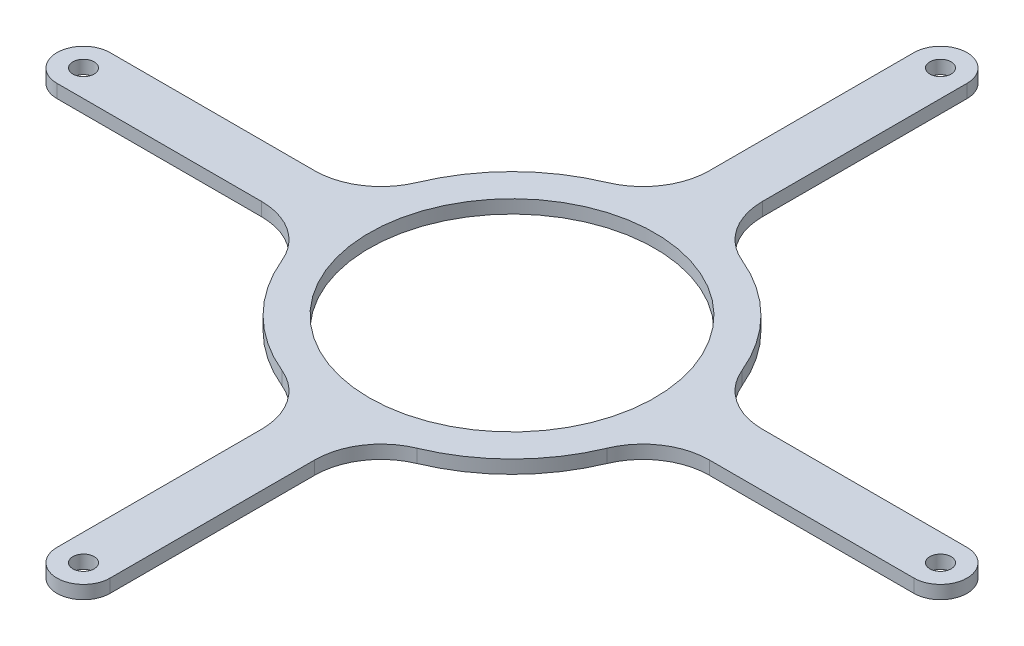
ISO-10303-21;
HEADER;
FILE_DESCRIPTION(('STEP AP214'),'2;1');
FILE_NAME('part.step','',(''),(''),'','','');
FILE_SCHEMA(('AUTOMOTIVE_DESIGN { 1 0 10303 214 1 1 1 1 }'));
ENDSEC;
DATA;
#1=APPLICATION_CONTEXT('core data for automotive mechanical design processes');
#2=APPLICATION_PROTOCOL_DEFINITION('international standard','automotive_design',2000,#1);
#3=PRODUCT_CONTEXT('',#1,'mechanical');
#4=PRODUCT('Part','Part','',(#3));
#5=PRODUCT_RELATED_PRODUCT_CATEGORY('part','',(#4));
#6=PRODUCT_DEFINITION_FORMATION('','',#4);
#7=PRODUCT_DEFINITION_CONTEXT('part definition',#1,'design');
#8=PRODUCT_DEFINITION('design','',#6,#7);
#9=PRODUCT_DEFINITION_SHAPE('','',#8);
#10=(LENGTH_UNIT() NAMED_UNIT(*) SI_UNIT(.MILLI.,.METRE.));
#11=(NAMED_UNIT(*) PLANE_ANGLE_UNIT() SI_UNIT($,.RADIAN.));
#12=(NAMED_UNIT(*) SI_UNIT($,.STERADIAN.) SOLID_ANGLE_UNIT());
#13=UNCERTAINTY_MEASURE_WITH_UNIT(LENGTH_MEASURE(1.E-05),#10,'distance_accuracy_value','');
#14=(GEOMETRIC_REPRESENTATION_CONTEXT(3) GLOBAL_UNCERTAINTY_ASSIGNED_CONTEXT((#13)) GLOBAL_UNIT_ASSIGNED_CONTEXT((#10,
#11,#12)) REPRESENTATION_CONTEXT('',''));
#15=CARTESIAN_POINT('',(0.,0.,0.));
#16=DIRECTION('',(0.,0.,1.));
#17=DIRECTION('',(1.,0.,0.));
#18=AXIS2_PLACEMENT_3D('',#15,#16,#17);
#19=CARTESIAN_POINT('',(0.,2.,0.));
#20=DIRECTION('',(0.,1.,0.));
#21=DIRECTION('',(0.,0.,1.));
#22=AXIS2_PLACEMENT_3D('',#19,#20,#21);
#23=PLANE('',#22);
#24=CARTESIAN_POINT('',(0.,2.,64.4999999999991));
#25=DIRECTION('',(0.,1.,0.));
#26=DIRECTION('',(0.,0.,1.));
#27=AXIS2_PLACEMENT_3D('',#24,#25,#26);
#28=CIRCLE('',#27,1.6);
#29=CARTESIAN_POINT('',(0.,2.,66.0999999999991));
#30=VERTEX_POINT('',#29);
#31=EDGE_CURVE('E566',#30,#30,#28,.T.);
#32=ORIENTED_EDGE('',*,*,#31,.F.);
#33=EDGE_LOOP('',(#32));
#34=FACE_BOUND('',#33,.T.);
#35=CARTESIAN_POINT('',(-1.46367293285543E-13,2.,-64.4999999999991));
#36=DIRECTION('',(0.,1.,0.));
#37=DIRECTION('',(0.,0.,1.));
#38=AXIS2_PLACEMENT_3D('',#35,#36,#37);
#39=CIRCLE('',#38,1.6);
#40=CARTESIAN_POINT('',(-1.46367293285543E-13,2.,-62.8999999999991));
#41=VERTEX_POINT('',#40);
#42=EDGE_CURVE('E550',#41,#41,#39,.T.);
#43=ORIENTED_EDGE('',*,*,#42,.F.);
#44=EDGE_LOOP('',(#43));
#45=FACE_BOUND('',#44,.T.);
#46=DIRECTION('',(-1.,0.,0.));
#47=VECTOR('',#46,1.);
#48=CARTESIAN_POINT('',(26.1963737948595,2.,-4.));
#49=LINE('',#48,#47);
#50=CARTESIAN_POINT('',(64.4999999999991,2.,-4.));
#51=VERTEX_POINT('',#50);
#52=CARTESIAN_POINT('',(33.7083075813664,2.,-4.));
#53=VERTEX_POINT('',#52);
#54=EDGE_CURVE('E279',#51,#53,#49,.T.);
#55=ORIENTED_EDGE('',*,*,#54,.T.);
#56=CARTESIAN_POINT('',(33.7083075813664,2.,-14.));
#57=DIRECTION('',(0.,1.,0.));
#58=DIRECTION('',(0.,0.,1.));
#59=AXIS2_PLACEMENT_3D('',#56,#57,#58);
#60=CIRCLE('',#59,10.);
#61=CARTESIAN_POINT('',(24.4731548193482,2.,-10.1643835616438));
#62=VERTEX_POINT('',#61);
#63=EDGE_CURVE('E420',#53,#62,#60,.F.);
#64=ORIENTED_EDGE('',*,*,#63,.T.);
#65=CARTESIAN_POINT('',(0.,2.,0.));
#66=DIRECTION('',(0.,1.,0.));
#67=DIRECTION('',(0.,0.,1.));
#68=AXIS2_PLACEMENT_3D('',#65,#66,#67);
#69=CIRCLE('',#68,26.5);
#70=CARTESIAN_POINT('',(10.1643835616439,2.,-24.4731548193482));
#71=VERTEX_POINT('',#70);
#72=EDGE_CURVE('E219',#62,#71,#69,.T.);
#73=ORIENTED_EDGE('',*,*,#72,.T.);
#74=CARTESIAN_POINT('',(14.,2.,-33.7083075813664));
#75=DIRECTION('',(0.,1.,0.));
#76=DIRECTION('',(0.,0.,1.));
#77=AXIS2_PLACEMENT_3D('',#74,#75,#76);
#78=CIRCLE('',#77,10.);
#79=CARTESIAN_POINT('',(4.,2.,-33.7083075813664));
#80=VERTEX_POINT('',#79);
#81=EDGE_CURVE('E214',#71,#80,#78,.F.);
#82=ORIENTED_EDGE('',*,*,#81,.T.);
#83=DIRECTION('',(0.,0.,-1.));
#84=VECTOR('',#83,1.);
#85=CARTESIAN_POINT('',(4.,2.,-26.1963737948595));
#86=LINE('',#85,#84);
#87=CARTESIAN_POINT('',(4.,2.,-64.4999999999991));
#88=VERTEX_POINT('',#87);
#89=EDGE_CURVE('E204',#80,#88,#86,.T.);
#90=ORIENTED_EDGE('',*,*,#89,.T.);
#91=CARTESIAN_POINT('',(-1.46367293285543E-13,2.,-64.4999999999991));
#92=DIRECTION('',(0.,1.,0.));
#93=DIRECTION('',(0.,0.,1.));
#94=AXIS2_PLACEMENT_3D('',#91,#92,#93);
#95=CIRCLE('',#94,4.);
#96=CARTESIAN_POINT('',(-4.00000000000015,2.,-64.4999999999991));
#97=VERTEX_POINT('',#96);
#98=EDGE_CURVE('E210',#88,#97,#95,.T.);
#99=ORIENTED_EDGE('',*,*,#98,.T.);
#100=DIRECTION('',(0.,0.,1.));
#101=VECTOR('',#100,1.);
#102=CARTESIAN_POINT('',(-4.,2.,-26.1963737948595));
#103=LINE('',#102,#101);
#104=CARTESIAN_POINT('',(-4.,2.,-33.7083075813664));
#105=VERTEX_POINT('',#104);
#106=EDGE_CURVE('E236',#97,#105,#103,.T.);
#107=ORIENTED_EDGE('',*,*,#106,.T.);
#108=CARTESIAN_POINT('',(-14.,2.,-33.7083075813664));
#109=DIRECTION('',(0.,1.,0.));
#110=DIRECTION('',(0.,0.,1.));
#111=AXIS2_PLACEMENT_3D('',#108,#109,#110);
#112=CIRCLE('',#111,10.);
#113=CARTESIAN_POINT('',(-10.1643835616438,2.,-24.4731548193482));
#114=VERTEX_POINT('',#113);
#115=EDGE_CURVE('E450',#105,#114,#112,.F.);
#116=ORIENTED_EDGE('',*,*,#115,.T.);
#117=CARTESIAN_POINT('',(0.,2.,0.));
#118=DIRECTION('',(0.,1.,0.));
#119=DIRECTION('',(0.,0.,1.));
#120=AXIS2_PLACEMENT_3D('',#117,#118,#119);
#121=CIRCLE('',#120,26.5000000000001);
#122=CARTESIAN_POINT('',(-24.4731548193482,2.,-10.1643835616438));
#123=VERTEX_POINT('',#122);
#124=EDGE_CURVE('E239',#114,#123,#121,.T.);
#125=ORIENTED_EDGE('',*,*,#124,.T.);
#126=CARTESIAN_POINT('',(-33.7083075813664,2.,-14.));
#127=DIRECTION('',(0.,1.,0.));
#128=DIRECTION('',(0.,0.,1.));
#129=AXIS2_PLACEMENT_3D('',#126,#127,#128);
#130=CIRCLE('',#129,10.);
#131=CARTESIAN_POINT('',(-33.7083075813664,2.,-3.99999999999999));
#132=VERTEX_POINT('',#131);
#133=EDGE_CURVE('E11',#123,#132,#130,.F.);
#134=ORIENTED_EDGE('',*,*,#133,.T.);
#135=DIRECTION('',(-1.,0.,0.));
#136=VECTOR('',#135,1.);
#137=CARTESIAN_POINT('',(-26.1963737948595,2.,-3.99999999999999));
#138=LINE('',#137,#136);
#139=CARTESIAN_POINT('',(-64.4999999999991,2.,-3.99999999999999));
#140=VERTEX_POINT('',#139);
#141=EDGE_CURVE('E245',#132,#140,#138,.T.);
#142=ORIENTED_EDGE('',*,*,#141,.T.);
#143=CARTESIAN_POINT('',(-64.4999999999991,2.,0.));
#144=DIRECTION('',(0.,1.,0.));
#145=DIRECTION('',(0.,0.,1.));
#146=AXIS2_PLACEMENT_3D('',#143,#144,#145);
#147=CIRCLE('',#146,4.);
#148=CARTESIAN_POINT('',(-64.4999999999991,2.,4.00000000000001));
#149=VERTEX_POINT('',#148);
#150=EDGE_CURVE('E248',#140,#149,#147,.T.);
#151=ORIENTED_EDGE('',*,*,#150,.T.);
#152=DIRECTION('',(1.,0.,0.));
#153=VECTOR('',#152,1.);
#154=CARTESIAN_POINT('',(-26.1963737948595,2.,4.00000000000001));
#155=LINE('',#154,#153);
#156=CARTESIAN_POINT('',(-33.7083075813664,2.,4.00000000000001));
#157=VERTEX_POINT('',#156);
#158=EDGE_CURVE('E251',#149,#157,#155,.T.);
#159=ORIENTED_EDGE('',*,*,#158,.T.);
#160=CARTESIAN_POINT('',(-33.7083075813664,2.,14.));
#161=DIRECTION('',(0.,1.,0.));
#162=DIRECTION('',(0.,0.,1.));
#163=AXIS2_PLACEMENT_3D('',#160,#161,#162);
#164=CIRCLE('',#163,10.);
#165=CARTESIAN_POINT('',(-24.4731548193482,2.,10.1643835616439));
#166=VERTEX_POINT('',#165);
#167=EDGE_CURVE('E444',#157,#166,#164,.F.);
#168=ORIENTED_EDGE('',*,*,#167,.T.);
#169=CARTESIAN_POINT('',(0.,2.,0.));
#170=DIRECTION('',(0.,1.,0.));
#171=DIRECTION('',(0.,0.,1.));
#172=AXIS2_PLACEMENT_3D('',#169,#170,#171);
#173=CIRCLE('',#172,26.5);
#174=CARTESIAN_POINT('',(-10.1643835616438,2.,24.4731548193482));
#175=VERTEX_POINT('',#174);
#176=EDGE_CURVE('E255',#166,#175,#173,.T.);
#177=ORIENTED_EDGE('',*,*,#176,.T.);
#178=CARTESIAN_POINT('',(-14.,2.,33.7083075813664));
#179=DIRECTION('',(0.,1.,0.));
#180=DIRECTION('',(0.,0.,1.));
#181=AXIS2_PLACEMENT_3D('',#178,#179,#180);
#182=CIRCLE('',#181,10.);
#183=CARTESIAN_POINT('',(-4.,2.,33.7083075813664));
#184=VERTEX_POINT('',#183);
#185=EDGE_CURVE('E438',#175,#184,#182,.F.);
#186=ORIENTED_EDGE('',*,*,#185,.T.);
#187=DIRECTION('',(0.,0.,1.));
#188=VECTOR('',#187,1.);
#189=CARTESIAN_POINT('',(-4.,2.,26.1963737948595));
#190=LINE('',#189,#188);
#191=CARTESIAN_POINT('',(-3.99999999999999,2.,64.4999999999991));
#192=VERTEX_POINT('',#191);
#193=EDGE_CURVE('E259',#184,#192,#190,.T.);
#194=ORIENTED_EDGE('',*,*,#193,.T.);
#195=CARTESIAN_POINT('',(0.,2.,64.4999999999991));
#196=DIRECTION('',(0.,1.,0.));
#197=DIRECTION('',(0.,0.,1.));
#198=AXIS2_PLACEMENT_3D('',#195,#196,#197);
#199=CIRCLE('',#198,4.);
#200=CARTESIAN_POINT('',(4.00000000000001,2.,64.4999999999991));
#201=VERTEX_POINT('',#200);
#202=EDGE_CURVE('E262',#192,#201,#199,.T.);
#203=ORIENTED_EDGE('',*,*,#202,.T.);
#204=DIRECTION('',(0.,0.,-1.));
#205=VECTOR('',#204,1.);
#206=CARTESIAN_POINT('',(4.,2.,26.1963737948595));
#207=LINE('',#206,#205);
#208=CARTESIAN_POINT('',(4.,2.,33.7083075813664));
#209=VERTEX_POINT('',#208);
#210=EDGE_CURVE('E265',#201,#209,#207,.T.);
#211=ORIENTED_EDGE('',*,*,#210,.T.);
#212=CARTESIAN_POINT('',(14.,2.,33.7083075813664));
#213=DIRECTION('',(0.,1.,0.));
#214=DIRECTION('',(0.,0.,1.));
#215=AXIS2_PLACEMENT_3D('',#212,#213,#214);
#216=CIRCLE('',#215,10.);
#217=CARTESIAN_POINT('',(10.1643835616439,2.,24.4731548193482));
#218=VERTEX_POINT('',#217);
#219=EDGE_CURVE('E432',#209,#218,#216,.F.);
#220=ORIENTED_EDGE('',*,*,#219,.T.);
#221=CARTESIAN_POINT('',(0.,2.,0.));
#222=DIRECTION('',(0.,1.,0.));
#223=DIRECTION('',(0.,0.,1.));
#224=AXIS2_PLACEMENT_3D('',#221,#222,#223);
#225=CIRCLE('',#224,26.5);
#226=CARTESIAN_POINT('',(24.4731548193482,2.,10.1643835616438));
#227=VERTEX_POINT('',#226);
#228=EDGE_CURVE('E269',#218,#227,#225,.T.);
#229=ORIENTED_EDGE('',*,*,#228,.T.);
#230=CARTESIAN_POINT('',(33.7083075813664,2.,14.));
#231=DIRECTION('',(0.,1.,0.));
#232=DIRECTION('',(0.,0.,1.));
#233=AXIS2_PLACEMENT_3D('',#230,#231,#232);
#234=CIRCLE('',#233,10.);
#235=CARTESIAN_POINT('',(33.7083075813664,2.,4.));
#236=VERTEX_POINT('',#235);
#237=EDGE_CURVE('E426',#227,#236,#234,.F.);
#238=ORIENTED_EDGE('',*,*,#237,.T.);
#239=DIRECTION('',(1.,0.,0.));
#240=VECTOR('',#239,1.);
#241=CARTESIAN_POINT('',(26.1963737948595,2.,4.));
#242=LINE('',#241,#240);
#243=CARTESIAN_POINT('',(64.4999999999991,2.,4.));
#244=VERTEX_POINT('',#243);
#245=EDGE_CURVE('E273',#236,#244,#242,.T.);
#246=ORIENTED_EDGE('',*,*,#245,.T.);
#247=CARTESIAN_POINT('',(64.4999999999991,2.,0.));
#248=DIRECTION('',(0.,1.,0.));
#249=DIRECTION('',(0.,0.,1.));
#250=AXIS2_PLACEMENT_3D('',#247,#248,#249);
#251=CIRCLE('',#250,4.);
#252=EDGE_CURVE('E276',#244,#51,#251,.T.);
#253=ORIENTED_EDGE('',*,*,#252,.T.);
#254=EDGE_LOOP('',(#55,#64,#73,#82,#90,#99,#107,#116,#125,#134,#142,#151,#159,#168,#177,#186,
#194,#203,#211,#220,#229,#238,#246,#253));
#255=FACE_BOUND('',#254,.T.);
#256=CARTESIAN_POINT('',(0.,2.,0.));
#257=DIRECTION('',(0.,1.,0.));
#258=DIRECTION('',(0.,0.,1.));
#259=AXIS2_PLACEMENT_3D('',#256,#257,#258);
#260=CIRCLE('',#259,21.5);
#261=CARTESIAN_POINT('',(0.,2.,21.5));
#262=VERTEX_POINT('',#261);
#263=EDGE_CURVE('E287',#262,#262,#260,.T.);
#264=ORIENTED_EDGE('',*,*,#263,.F.);
#265=EDGE_LOOP('',(#264));
#266=FACE_BOUND('',#265,.T.);
#267=CARTESIAN_POINT('',(64.4999999999991,2.,0.));
#268=DIRECTION('',(0.,1.,0.));
#269=DIRECTION('',(0.,0.,1.));
#270=AXIS2_PLACEMENT_3D('',#267,#268,#269);
#271=CIRCLE('',#270,1.60000000000001);
#272=CARTESIAN_POINT('',(64.4999999999991,2.,1.6));
#273=VERTEX_POINT('',#272);
#274=EDGE_CURVE('E558',#273,#273,#271,.T.);
#275=ORIENTED_EDGE('',*,*,#274,.F.);
#276=EDGE_LOOP('',(#275));
#277=FACE_BOUND('',#276,.T.);
#278=CARTESIAN_POINT('',(-64.4999999999991,2.,0.));
#279=DIRECTION('',(0.,1.,0.));
#280=DIRECTION('',(0.,0.,1.));
#281=AXIS2_PLACEMENT_3D('',#278,#279,#280);
#282=CIRCLE('',#281,1.60000000000001);
#283=CARTESIAN_POINT('',(-64.4999999999991,2.,1.60000000000002));
#284=VERTEX_POINT('',#283);
#285=EDGE_CURVE('E574',#284,#284,#282,.T.);
#286=ORIENTED_EDGE('',*,*,#285,.F.);
#287=EDGE_LOOP('',(#286));
#288=FACE_BOUND('',#287,.T.);
#289=ADVANCED_FACE('F45',(#34,#45,#255,#266,#277,#288),#23,.T.);
#290=CARTESIAN_POINT('',(0.,0.,0.));
#291=DIRECTION('',(0.,1.,0.));
#292=DIRECTION('',(0.,0.,1.));
#293=AXIS2_PLACEMENT_3D('',#290,#291,#292);
#294=PLANE('',#293);
#295=CARTESIAN_POINT('',(0.,0.,0.));
#296=DIRECTION('',(0.,1.,0.));
#297=DIRECTION('',(0.,0.,1.));
#298=AXIS2_PLACEMENT_3D('',#295,#296,#297);
#299=CIRCLE('',#298,26.5);
#300=CARTESIAN_POINT('',(24.4731548193482,0.,-10.1643835616438));
#301=VERTEX_POINT('',#300);
#302=CARTESIAN_POINT('',(10.1643835616439,0.,-24.4731548193482));
#303=VERTEX_POINT('',#302);
#304=EDGE_CURVE('E283',#301,#303,#299,.T.);
#305=ORIENTED_EDGE('',*,*,#304,.F.);
#306=CARTESIAN_POINT('',(33.7083075813664,0.,-14.));
#307=DIRECTION('',(0.,1.,0.));
#308=DIRECTION('',(0.,0.,1.));
#309=AXIS2_PLACEMENT_3D('',#306,#307,#308);
#310=CIRCLE('',#309,10.);
#311=CARTESIAN_POINT('',(33.7083075813664,0.,-4.));
#312=VERTEX_POINT('',#311);
#313=EDGE_CURVE('E417',#301,#312,#310,.T.);
#314=ORIENTED_EDGE('',*,*,#313,.T.);
#315=DIRECTION('',(-1.,0.,0.));
#316=VECTOR('',#315,1.);
#317=CARTESIAN_POINT('',(26.1963737948595,0.,-4.));
#318=LINE('',#317,#316);
#319=CARTESIAN_POINT('',(64.4999999999991,0.,-4.));
#320=VERTEX_POINT('',#319);
#321=EDGE_CURVE('E335',#320,#312,#318,.T.);
#322=ORIENTED_EDGE('',*,*,#321,.F.);
#323=CARTESIAN_POINT('',(64.4999999999991,0.,0.));
#324=DIRECTION('',(0.,1.,0.));
#325=DIRECTION('',(0.,0.,1.));
#326=AXIS2_PLACEMENT_3D('',#323,#324,#325);
#327=CIRCLE('',#326,4.);
#328=CARTESIAN_POINT('',(64.4999999999991,0.,4.));
#329=VERTEX_POINT('',#328);
#330=EDGE_CURVE('E332',#329,#320,#327,.T.);
#331=ORIENTED_EDGE('',*,*,#330,.F.);
#332=DIRECTION('',(1.,0.,0.));
#333=VECTOR('',#332,1.);
#334=CARTESIAN_POINT('',(26.1963737948595,0.,4.));
#335=LINE('',#334,#333);
#336=CARTESIAN_POINT('',(33.7083075813664,0.,4.));
#337=VERTEX_POINT('',#336);
#338=EDGE_CURVE('E329',#337,#329,#335,.T.);
#339=ORIENTED_EDGE('',*,*,#338,.F.);
#340=CARTESIAN_POINT('',(33.7083075813664,0.,14.));
#341=DIRECTION('',(0.,1.,0.));
#342=DIRECTION('',(0.,0.,1.));
#343=AXIS2_PLACEMENT_3D('',#340,#341,#342);
#344=CIRCLE('',#343,10.);
#345=CARTESIAN_POINT('',(24.4731548193482,0.,10.1643835616438));
#346=VERTEX_POINT('',#345);
#347=EDGE_CURVE('E423',#337,#346,#344,.T.);
#348=ORIENTED_EDGE('',*,*,#347,.T.);
#349=CARTESIAN_POINT('',(0.,0.,0.));
#350=DIRECTION('',(0.,1.,0.));
#351=DIRECTION('',(0.,0.,1.));
#352=AXIS2_PLACEMENT_3D('',#349,#350,#351);
#353=CIRCLE('',#352,26.5);
#354=CARTESIAN_POINT('',(10.1643835616439,0.,24.4731548193482));
#355=VERTEX_POINT('',#354);
#356=EDGE_CURVE('E325',#355,#346,#353,.T.);
#357=ORIENTED_EDGE('',*,*,#356,.F.);
#358=CARTESIAN_POINT('',(14.,0.,33.7083075813664));
#359=DIRECTION('',(0.,1.,0.));
#360=DIRECTION('',(0.,0.,1.));
#361=AXIS2_PLACEMENT_3D('',#358,#359,#360);
#362=CIRCLE('',#361,10.);
#363=CARTESIAN_POINT('',(4.,0.,33.7083075813664));
#364=VERTEX_POINT('',#363);
#365=EDGE_CURVE('E429',#355,#364,#362,.T.);
#366=ORIENTED_EDGE('',*,*,#365,.T.);
#367=DIRECTION('',(0.,0.,-1.));
#368=VECTOR('',#367,1.);
#369=CARTESIAN_POINT('',(4.,0.,26.1963737948595));
#370=LINE('',#369,#368);
#371=CARTESIAN_POINT('',(4.00000000000001,0.,64.4999999999991));
#372=VERTEX_POINT('',#371);
#373=EDGE_CURVE('E321',#372,#364,#370,.T.);
#374=ORIENTED_EDGE('',*,*,#373,.F.);
#375=CARTESIAN_POINT('',(0.,0.,64.4999999999991));
#376=DIRECTION('',(0.,1.,0.));
#377=DIRECTION('',(0.,0.,1.));
#378=AXIS2_PLACEMENT_3D('',#375,#376,#377);
#379=CIRCLE('',#378,4.);
#380=CARTESIAN_POINT('',(-3.99999999999999,0.,64.4999999999991));
#381=VERTEX_POINT('',#380);
#382=EDGE_CURVE('E318',#381,#372,#379,.T.);
#383=ORIENTED_EDGE('',*,*,#382,.F.);
#384=DIRECTION('',(0.,0.,1.));
#385=VECTOR('',#384,1.);
#386=CARTESIAN_POINT('',(-4.,0.,26.1963737948595));
#387=LINE('',#386,#385);
#388=CARTESIAN_POINT('',(-4.,0.,33.7083075813664));
#389=VERTEX_POINT('',#388);
#390=EDGE_CURVE('E315',#389,#381,#387,.T.);
#391=ORIENTED_EDGE('',*,*,#390,.F.);
#392=CARTESIAN_POINT('',(-14.,0.,33.7083075813664));
#393=DIRECTION('',(0.,1.,0.));
#394=DIRECTION('',(0.,0.,1.));
#395=AXIS2_PLACEMENT_3D('',#392,#393,#394);
#396=CIRCLE('',#395,10.);
#397=CARTESIAN_POINT('',(-10.1643835616438,0.,24.4731548193482));
#398=VERTEX_POINT('',#397);
#399=EDGE_CURVE('E435',#389,#398,#396,.T.);
#400=ORIENTED_EDGE('',*,*,#399,.T.);
#401=CARTESIAN_POINT('',(0.,0.,0.));
#402=DIRECTION('',(0.,1.,0.));
#403=DIRECTION('',(0.,0.,1.));
#404=AXIS2_PLACEMENT_3D('',#401,#402,#403);
#405=CIRCLE('',#404,26.5);
#406=CARTESIAN_POINT('',(-24.4731548193482,0.,10.1643835616439));
#407=VERTEX_POINT('',#406);
#408=EDGE_CURVE('E311',#407,#398,#405,.T.);
#409=ORIENTED_EDGE('',*,*,#408,.F.);
#410=CARTESIAN_POINT('',(-33.7083075813664,0.,14.));
#411=DIRECTION('',(0.,1.,0.));
#412=DIRECTION('',(0.,0.,1.));
#413=AXIS2_PLACEMENT_3D('',#410,#411,#412);
#414=CIRCLE('',#413,10.);
#415=CARTESIAN_POINT('',(-33.7083075813664,0.,4.00000000000001));
#416=VERTEX_POINT('',#415);
#417=EDGE_CURVE('E441',#407,#416,#414,.T.);
#418=ORIENTED_EDGE('',*,*,#417,.T.);
#419=DIRECTION('',(1.,0.,0.));
#420=VECTOR('',#419,1.);
#421=CARTESIAN_POINT('',(-26.1963737948595,0.,4.00000000000001));
#422=LINE('',#421,#420);
#423=CARTESIAN_POINT('',(-64.4999999999991,0.,4.00000000000001));
#424=VERTEX_POINT('',#423);
#425=EDGE_CURVE('E307',#424,#416,#422,.T.);
#426=ORIENTED_EDGE('',*,*,#425,.F.);
#427=CARTESIAN_POINT('',(-64.4999999999991,0.,0.));
#428=DIRECTION('',(0.,1.,0.));
#429=DIRECTION('',(0.,0.,1.));
#430=AXIS2_PLACEMENT_3D('',#427,#428,#429);
#431=CIRCLE('',#430,4.);
#432=CARTESIAN_POINT('',(-64.4999999999991,0.,-3.99999999999999));
#433=VERTEX_POINT('',#432);
#434=EDGE_CURVE('E304',#433,#424,#431,.T.);
#435=ORIENTED_EDGE('',*,*,#434,.F.);
#436=DIRECTION('',(-1.,0.,0.));
#437=VECTOR('',#436,1.);
#438=CARTESIAN_POINT('',(-26.1963737948595,0.,-3.99999999999999));
#439=LINE('',#438,#437);
#440=CARTESIAN_POINT('',(-33.7083075813664,0.,-3.99999999999999));
#441=VERTEX_POINT('',#440);
#442=EDGE_CURVE('E301',#441,#433,#439,.T.);
#443=ORIENTED_EDGE('',*,*,#442,.F.);
#444=CARTESIAN_POINT('',(-33.7083075813664,0.,-14.));
#445=DIRECTION('',(0.,1.,0.));
#446=DIRECTION('',(0.,0.,1.));
#447=AXIS2_PLACEMENT_3D('',#444,#445,#446);
#448=CIRCLE('',#447,10.);
#449=CARTESIAN_POINT('',(-24.4731548193482,0.,-10.1643835616438));
#450=VERTEX_POINT('',#449);
#451=EDGE_CURVE('E54',#441,#450,#448,.T.);
#452=ORIENTED_EDGE('',*,*,#451,.T.);
#453=CARTESIAN_POINT('',(0.,0.,0.));
#454=DIRECTION('',(0.,1.,0.));
#455=DIRECTION('',(0.,0.,1.));
#456=AXIS2_PLACEMENT_3D('',#453,#454,#455);
#457=CIRCLE('',#456,26.5000000000001);
#458=CARTESIAN_POINT('',(-10.1643835616438,0.,-24.4731548193482));
#459=VERTEX_POINT('',#458);
#460=EDGE_CURVE('E297',#459,#450,#457,.T.);
#461=ORIENTED_EDGE('',*,*,#460,.F.);
#462=CARTESIAN_POINT('',(-14.,0.,-33.7083075813664));
#463=DIRECTION('',(0.,1.,0.));
#464=DIRECTION('',(0.,0.,1.));
#465=AXIS2_PLACEMENT_3D('',#462,#463,#464);
#466=CIRCLE('',#465,10.);
#467=CARTESIAN_POINT('',(-4.,0.,-33.7083075813664));
#468=VERTEX_POINT('',#467);
#469=EDGE_CURVE('E447',#459,#468,#466,.T.);
#470=ORIENTED_EDGE('',*,*,#469,.T.);
#471=DIRECTION('',(0.,0.,1.));
#472=VECTOR('',#471,1.);
#473=CARTESIAN_POINT('',(-4.,0.,-26.1963737948595));
#474=LINE('',#473,#472);
#475=CARTESIAN_POINT('',(-4.00000000000015,0.,-64.4999999999991));
#476=VERTEX_POINT('',#475);
#477=EDGE_CURVE('E293',#476,#468,#474,.T.);
#478=ORIENTED_EDGE('',*,*,#477,.F.);
#479=CARTESIAN_POINT('',(-1.46367293285543E-13,0.,-64.4999999999991));
#480=DIRECTION('',(0.,1.,0.));
#481=DIRECTION('',(0.,0.,1.));
#482=AXIS2_PLACEMENT_3D('',#479,#480,#481);
#483=CIRCLE('',#482,4.);
#484=CARTESIAN_POINT('',(4.,0.,-64.4999999999991));
#485=VERTEX_POINT('',#484);
#486=EDGE_CURVE('E290',#485,#476,#483,.T.);
#487=ORIENTED_EDGE('',*,*,#486,.F.);
#488=DIRECTION('',(0.,0.,-1.));
#489=VECTOR('',#488,1.);
#490=CARTESIAN_POINT('',(4.,0.,-26.1963737948595));
#491=LINE('',#490,#489);
#492=CARTESIAN_POINT('',(4.,0.,-33.7083075813664));
#493=VERTEX_POINT('',#492);
#494=EDGE_CURVE('E225',#493,#485,#491,.T.);
#495=ORIENTED_EDGE('',*,*,#494,.F.);
#496=CARTESIAN_POINT('',(14.,0.,-33.7083075813664));
#497=DIRECTION('',(0.,1.,0.));
#498=DIRECTION('',(0.,0.,1.));
#499=AXIS2_PLACEMENT_3D('',#496,#497,#498);
#500=CIRCLE('',#499,10.);
#501=EDGE_CURVE('E453',#493,#303,#500,.T.);
#502=ORIENTED_EDGE('',*,*,#501,.T.);
#503=EDGE_LOOP('',(#305,#314,#322,#331,#339,#348,#357,#366,#374,#383,#391,#400,#409,#418,#426,
#435,#443,#452,#461,#470,#478,#487,#495,#502));
#504=FACE_BOUND('',#503,.T.);
#505=CARTESIAN_POINT('',(0.,0.,0.));
#506=DIRECTION('',(0.,1.,0.));
#507=DIRECTION('',(0.,0.,1.));
#508=AXIS2_PLACEMENT_3D('',#505,#506,#507);
#509=CIRCLE('',#508,21.5);
#510=CARTESIAN_POINT('',(0.,0.,21.5));
#511=VERTEX_POINT('',#510);
#512=EDGE_CURVE('E546',#511,#511,#509,.T.);
#513=ORIENTED_EDGE('',*,*,#512,.T.);
#514=EDGE_LOOP('',(#513));
#515=FACE_BOUND('',#514,.T.);
#516=CARTESIAN_POINT('',(-1.46367293285543E-13,0.,-64.4999999999991));
#517=DIRECTION('',(0.,1.,0.));
#518=DIRECTION('',(0.,0.,1.));
#519=AXIS2_PLACEMENT_3D('',#516,#517,#518);
#520=CIRCLE('',#519,1.6);
#521=CARTESIAN_POINT('',(-1.46367293285543E-13,0.,-62.8999999999991));
#522=VERTEX_POINT('',#521);
#523=EDGE_CURVE('E554',#522,#522,#520,.T.);
#524=ORIENTED_EDGE('',*,*,#523,.T.);
#525=EDGE_LOOP('',(#524));
#526=FACE_BOUND('',#525,.T.);
#527=CARTESIAN_POINT('',(64.4999999999991,0.,0.));
#528=DIRECTION('',(0.,1.,0.));
#529=DIRECTION('',(0.,0.,1.));
#530=AXIS2_PLACEMENT_3D('',#527,#528,#529);
#531=CIRCLE('',#530,1.60000000000001);
#532=CARTESIAN_POINT('',(64.4999999999991,0.,1.6));
#533=VERTEX_POINT('',#532);
#534=EDGE_CURVE('E562',#533,#533,#531,.T.);
#535=ORIENTED_EDGE('',*,*,#534,.T.);
#536=EDGE_LOOP('',(#535));
#537=FACE_BOUND('',#536,.T.);
#538=CARTESIAN_POINT('',(0.,0.,64.4999999999991));
#539=DIRECTION('',(0.,1.,0.));
#540=DIRECTION('',(0.,0.,1.));
#541=AXIS2_PLACEMENT_3D('',#538,#539,#540);
#542=CIRCLE('',#541,1.6);
#543=CARTESIAN_POINT('',(0.,0.,66.0999999999991));
#544=VERTEX_POINT('',#543);
#545=EDGE_CURVE('E570',#544,#544,#542,.T.);
#546=ORIENTED_EDGE('',*,*,#545,.T.);
#547=EDGE_LOOP('',(#546));
#548=FACE_BOUND('',#547,.T.);
#549=CARTESIAN_POINT('',(-64.4999999999991,0.,0.));
#550=DIRECTION('',(0.,1.,0.));
#551=DIRECTION('',(0.,0.,1.));
#552=AXIS2_PLACEMENT_3D('',#549,#550,#551);
#553=CIRCLE('',#552,1.60000000000001);
#554=CARTESIAN_POINT('',(-64.4999999999991,0.,1.60000000000002));
#555=VERTEX_POINT('',#554);
#556=EDGE_CURVE('E578',#555,#555,#553,.T.);
#557=ORIENTED_EDGE('',*,*,#556,.T.);
#558=EDGE_LOOP('',(#557));
#559=FACE_BOUND('',#558,.T.);
#560=ADVANCED_FACE('F462',(#504,#515,#526,#537,#548,#559),#294,.F.);
#561=CARTESIAN_POINT('',(0.,2.,0.));
#562=DIRECTION('',(0.,-1.,0.));
#563=DIRECTION('',(0.,0.,-1.));
#564=AXIS2_PLACEMENT_3D('',#561,#562,#563);
#565=CYLINDRICAL_SURFACE('',#564,26.5);
#566=ORIENTED_EDGE('',*,*,#72,.F.);
#567=DIRECTION('',(0.,-1.,0.));
#568=VECTOR('',#567,1.);
#569=CARTESIAN_POINT('',(24.4731548193482,2.,-10.1643835616438));
#570=LINE('',#569,#568);
#571=EDGE_CURVE('E366',#62,#301,#570,.T.);
#572=ORIENTED_EDGE('',*,*,#571,.T.);
#573=ORIENTED_EDGE('',*,*,#304,.T.);
#574=DIRECTION('',(0.,-1.,0.));
#575=VECTOR('',#574,1.);
#576=CARTESIAN_POINT('',(10.1643835616439,2.,-24.4731548193482));
#577=LINE('',#576,#575);
#578=EDGE_CURVE('E229',#303,#71,#577,.F.);
#579=ORIENTED_EDGE('',*,*,#578,.T.);
#580=EDGE_LOOP('',(#566,#572,#573,#579));
#581=FACE_BOUND('',#580,.T.);
#582=ADVANCED_FACE('F542',(#581),#565,.T.);
#583=CARTESIAN_POINT('',(4.,2.,-26.1963737948595));
#584=DIRECTION('',(-1.,0.,0.));
#585=DIRECTION('',(0.,0.,1.));
#586=AXIS2_PLACEMENT_3D('',#583,#584,#585);
#587=PLANE('',#586);
#588=ORIENTED_EDGE('',*,*,#89,.F.);
#589=DIRECTION('',(0.,1.,0.));
#590=VECTOR('',#589,1.);
#591=CARTESIAN_POINT('',(4.,0.,-33.7083075813664));
#592=LINE('',#591,#590);
#593=EDGE_CURVE('E411',#80,#493,#592,.F.);
#594=ORIENTED_EDGE('',*,*,#593,.T.);
#595=ORIENTED_EDGE('',*,*,#494,.T.);
#596=DIRECTION('',(0.,-1.,0.));
#597=VECTOR('',#596,1.);
#598=CARTESIAN_POINT('',(4.,2.,-64.4999999999991));
#599=LINE('',#598,#597);
#600=EDGE_CURVE('E222',#88,#485,#599,.T.);
#601=ORIENTED_EDGE('',*,*,#600,.F.);
#602=EDGE_LOOP('',(#588,#594,#595,#601));
#603=FACE_BOUND('',#602,.T.);
#604=ADVANCED_FACE('F223',(#603),#587,.F.);
#605=CARTESIAN_POINT('',(-1.46367293285543E-13,2.,-64.4999999999991));
#606=DIRECTION('',(0.,-1.,0.));
#607=DIRECTION('',(0.,0.,-1.));
#608=AXIS2_PLACEMENT_3D('',#605,#606,#607);
#609=CYLINDRICAL_SURFACE('',#608,4.);
#610=ORIENTED_EDGE('',*,*,#486,.T.);
#611=DIRECTION('',(0.,-1.,0.));
#612=VECTOR('',#611,1.);
#613=CARTESIAN_POINT('',(-4.00000000000015,2.,-64.4999999999991));
#614=LINE('',#613,#612);
#615=EDGE_CURVE('E230',#97,#476,#614,.T.);
#616=ORIENTED_EDGE('',*,*,#615,.F.);
#617=ORIENTED_EDGE('',*,*,#98,.F.);
#618=ORIENTED_EDGE('',*,*,#600,.T.);
#619=EDGE_LOOP('',(#610,#616,#617,#618));
#620=FACE_BOUND('',#619,.T.);
#621=ADVANCED_FACE('F232',(#620),#609,.T.);
#622=CARTESIAN_POINT('',(-4.,2.,-26.1963737948595));
#623=DIRECTION('',(1.,0.,0.));
#624=DIRECTION('',(0.,0.,-1.));
#625=AXIS2_PLACEMENT_3D('',#622,#623,#624);
#626=PLANE('',#625);
#627=ORIENTED_EDGE('',*,*,#477,.T.);
#628=DIRECTION('',(0.,1.,0.));
#629=VECTOR('',#628,1.);
#630=CARTESIAN_POINT('',(-4.,2.,-33.7083075813664));
#631=LINE('',#630,#629);
#632=EDGE_CURVE('E408',#468,#105,#631,.T.);
#633=ORIENTED_EDGE('',*,*,#632,.T.);
#634=ORIENTED_EDGE('',*,*,#106,.F.);
#635=ORIENTED_EDGE('',*,*,#615,.T.);
#636=EDGE_LOOP('',(#627,#633,#634,#635));
#637=FACE_BOUND('',#636,.T.);
#638=ADVANCED_FACE('F628',(#637),#626,.F.);
#639=CARTESIAN_POINT('',(0.,2.,0.));
#640=DIRECTION('',(0.,-1.,0.));
#641=DIRECTION('',(0.,0.,-1.));
#642=AXIS2_PLACEMENT_3D('',#639,#640,#641);
#643=CYLINDRICAL_SURFACE('',#642,26.5000000000001);
#644=ORIENTED_EDGE('',*,*,#124,.F.);
#645=DIRECTION('',(0.,-1.,0.));
#646=VECTOR('',#645,1.);
#647=CARTESIAN_POINT('',(-10.1643835616438,2.,-24.4731548193482));
#648=LINE('',#647,#646);
#649=EDGE_CURVE('E404',#114,#459,#648,.T.);
#650=ORIENTED_EDGE('',*,*,#649,.T.);
#651=ORIENTED_EDGE('',*,*,#460,.T.);
#652=DIRECTION('',(0.,-1.,0.));
#653=VECTOR('',#652,1.);
#654=CARTESIAN_POINT('',(-24.4731548193482,2.,-10.1643835616438));
#655=LINE('',#654,#653);
#656=EDGE_CURVE('E401',#450,#123,#655,.F.);
#657=ORIENTED_EDGE('',*,*,#656,.T.);
#658=EDGE_LOOP('',(#644,#650,#651,#657));
#659=FACE_BOUND('',#658,.T.);
#660=ADVANCED_FACE('F467',(#659),#643,.T.);
#661=CARTESIAN_POINT('',(-26.1963737948595,2.,-3.99999999999999));
#662=DIRECTION('',(0.,0.,1.));
#663=DIRECTION('',(1.,0.,0.));
#664=AXIS2_PLACEMENT_3D('',#661,#662,#663);
#665=PLANE('',#664);
#666=ORIENTED_EDGE('',*,*,#141,.F.);
#667=DIRECTION('',(0.,1.,0.));
#668=VECTOR('',#667,1.);
#669=CARTESIAN_POINT('',(-33.7083075813664,0.,-3.99999999999999));
#670=LINE('',#669,#668);
#671=EDGE_CURVE('E414',#132,#441,#670,.F.);
#672=ORIENTED_EDGE('',*,*,#671,.T.);
#673=ORIENTED_EDGE('',*,*,#442,.T.);
#674=DIRECTION('',(0.,-1.,0.));
#675=VECTOR('',#674,1.);
#676=CARTESIAN_POINT('',(-64.4999999999991,2.,-3.99999999999999));
#677=LINE('',#676,#675);
#678=EDGE_CURVE('E358',#140,#433,#677,.T.);
#679=ORIENTED_EDGE('',*,*,#678,.F.);
#680=EDGE_LOOP('',(#666,#672,#673,#679));
#681=FACE_BOUND('',#680,.T.);
#682=ADVANCED_FACE('F470',(#681),#665,.F.);
#683=CARTESIAN_POINT('',(-64.4999999999991,2.,0.));
#684=DIRECTION('',(0.,-1.,0.));
#685=DIRECTION('',(0.,0.,-1.));
#686=AXIS2_PLACEMENT_3D('',#683,#684,#685);
#687=CYLINDRICAL_SURFACE('',#686,4.);
#688=ORIENTED_EDGE('',*,*,#434,.T.);
#689=DIRECTION('',(0.,-1.,0.));
#690=VECTOR('',#689,1.);
#691=CARTESIAN_POINT('',(-64.4999999999991,2.,4.00000000000001));
#692=LINE('',#691,#690);
#693=EDGE_CURVE('E354',#149,#424,#692,.T.);
#694=ORIENTED_EDGE('',*,*,#693,.F.);
#695=ORIENTED_EDGE('',*,*,#150,.F.);
#696=ORIENTED_EDGE('',*,*,#678,.T.);
#697=EDGE_LOOP('',(#688,#694,#695,#696));
#698=FACE_BOUND('',#697,.T.);
#699=ADVANCED_FACE('F477',(#698),#687,.T.);
#700=CARTESIAN_POINT('',(-26.1963737948595,2.,4.00000000000001));
#701=DIRECTION('',(0.,0.,-1.));
#702=DIRECTION('',(-1.,0.,0.));
#703=AXIS2_PLACEMENT_3D('',#700,#701,#702);
#704=PLANE('',#703);
#705=ORIENTED_EDGE('',*,*,#425,.T.);
#706=DIRECTION('',(0.,1.,0.));
#707=VECTOR('',#706,1.);
#708=CARTESIAN_POINT('',(-33.7083075813664,2.,4.00000000000001));
#709=LINE('',#708,#707);
#710=EDGE_CURVE('E398',#416,#157,#709,.T.);
#711=ORIENTED_EDGE('',*,*,#710,.T.);
#712=ORIENTED_EDGE('',*,*,#158,.F.);
#713=ORIENTED_EDGE('',*,*,#693,.T.);
#714=EDGE_LOOP('',(#705,#711,#712,#713));
#715=FACE_BOUND('',#714,.T.);
#716=ADVANCED_FACE('F480',(#715),#704,.F.);
#717=CARTESIAN_POINT('',(0.,2.,0.));
#718=DIRECTION('',(0.,-1.,0.));
#719=DIRECTION('',(0.,0.,-1.));
#720=AXIS2_PLACEMENT_3D('',#717,#718,#719);
#721=CYLINDRICAL_SURFACE('',#720,26.5);
#722=ORIENTED_EDGE('',*,*,#408,.T.);
#723=DIRECTION('',(0.,-1.,0.));
#724=VECTOR('',#723,1.);
#725=CARTESIAN_POINT('',(-10.1643835616438,2.,24.4731548193482));
#726=LINE('',#725,#724);
#727=EDGE_CURVE('E395',#398,#175,#726,.F.);
#728=ORIENTED_EDGE('',*,*,#727,.T.);
#729=ORIENTED_EDGE('',*,*,#176,.F.);
#730=DIRECTION('',(0.,-1.,0.));
#731=VECTOR('',#730,1.);
#732=CARTESIAN_POINT('',(-24.4731548193482,2.,10.1643835616439));
#733=LINE('',#732,#731);
#734=EDGE_CURVE('E391',#166,#407,#733,.T.);
#735=ORIENTED_EDGE('',*,*,#734,.T.);
#736=EDGE_LOOP('',(#722,#728,#729,#735));
#737=FACE_BOUND('',#736,.T.);
#738=ADVANCED_FACE('F488',(#737),#721,.T.);
#739=CARTESIAN_POINT('',(-4.,2.,26.1963737948595));
#740=DIRECTION('',(1.,0.,0.));
#741=DIRECTION('',(0.,0.,-1.));
#742=AXIS2_PLACEMENT_3D('',#739,#740,#741);
#743=PLANE('',#742);
#744=ORIENTED_EDGE('',*,*,#193,.F.);
#745=DIRECTION('',(0.,1.,0.));
#746=VECTOR('',#745,1.);
#747=CARTESIAN_POINT('',(-4.,0.,33.7083075813664));
#748=LINE('',#747,#746);
#749=EDGE_CURVE('E387',#184,#389,#748,.F.);
#750=ORIENTED_EDGE('',*,*,#749,.T.);
#751=ORIENTED_EDGE('',*,*,#390,.T.);
#752=DIRECTION('',(0.,-1.,0.));
#753=VECTOR('',#752,1.);
#754=CARTESIAN_POINT('',(-3.99999999999999,2.,64.4999999999991));
#755=LINE('',#754,#753);
#756=EDGE_CURVE('E350',#192,#381,#755,.T.);
#757=ORIENTED_EDGE('',*,*,#756,.F.);
#758=EDGE_LOOP('',(#744,#750,#751,#757));
#759=FACE_BOUND('',#758,.T.);
#760=ADVANCED_FACE('F497',(#759),#743,.F.);
#761=CARTESIAN_POINT('',(0.,2.,64.4999999999991));
#762=DIRECTION('',(0.,-1.,0.));
#763=DIRECTION('',(0.,0.,-1.));
#764=AXIS2_PLACEMENT_3D('',#761,#762,#763);
#765=CYLINDRICAL_SURFACE('',#764,4.);
#766=ORIENTED_EDGE('',*,*,#382,.T.);
#767=DIRECTION('',(0.,-1.,0.));
#768=VECTOR('',#767,1.);
#769=CARTESIAN_POINT('',(4.00000000000001,2.,64.4999999999991));
#770=LINE('',#769,#768);
#771=EDGE_CURVE('E346',#201,#372,#770,.T.);
#772=ORIENTED_EDGE('',*,*,#771,.F.);
#773=ORIENTED_EDGE('',*,*,#202,.F.);
#774=ORIENTED_EDGE('',*,*,#756,.T.);
#775=EDGE_LOOP('',(#766,#772,#773,#774));
#776=FACE_BOUND('',#775,.T.);
#777=ADVANCED_FACE('F503',(#776),#765,.T.);
#778=CARTESIAN_POINT('',(4.,2.,26.1963737948595));
#779=DIRECTION('',(-1.,0.,0.));
#780=DIRECTION('',(0.,0.,1.));
#781=AXIS2_PLACEMENT_3D('',#778,#779,#780);
#782=PLANE('',#781);
#783=ORIENTED_EDGE('',*,*,#373,.T.);
#784=DIRECTION('',(0.,1.,0.));
#785=VECTOR('',#784,1.);
#786=CARTESIAN_POINT('',(4.,2.,33.7083075813664));
#787=LINE('',#786,#785);
#788=EDGE_CURVE('E384',#364,#209,#787,.T.);
#789=ORIENTED_EDGE('',*,*,#788,.T.);
#790=ORIENTED_EDGE('',*,*,#210,.F.);
#791=ORIENTED_EDGE('',*,*,#771,.T.);
#792=EDGE_LOOP('',(#783,#789,#790,#791));
#793=FACE_BOUND('',#792,.T.);
#794=ADVANCED_FACE('F611',(#793),#782,.F.);
#795=CARTESIAN_POINT('',(0.,2.,0.));
#796=DIRECTION('',(0.,-1.,0.));
#797=DIRECTION('',(0.,0.,-1.));
#798=AXIS2_PLACEMENT_3D('',#795,#796,#797);
#799=CYLINDRICAL_SURFACE('',#798,26.5);
#800=ORIENTED_EDGE('',*,*,#356,.T.);
#801=DIRECTION('',(0.,-1.,0.));
#802=VECTOR('',#801,1.);
#803=CARTESIAN_POINT('',(24.4731548193482,2.,10.1643835616438));
#804=LINE('',#803,#802);
#805=EDGE_CURVE('E381',#346,#227,#804,.F.);
#806=ORIENTED_EDGE('',*,*,#805,.T.);
#807=ORIENTED_EDGE('',*,*,#228,.F.);
#808=DIRECTION('',(0.,-1.,0.));
#809=VECTOR('',#808,1.);
#810=CARTESIAN_POINT('',(10.1643835616439,2.,24.4731548193482));
#811=LINE('',#810,#809);
#812=EDGE_CURVE('E377',#218,#355,#811,.T.);
#813=ORIENTED_EDGE('',*,*,#812,.T.);
#814=EDGE_LOOP('',(#800,#806,#807,#813));
#815=FACE_BOUND('',#814,.T.);
#816=ADVANCED_FACE('F514',(#815),#799,.T.);
#817=CARTESIAN_POINT('',(26.1963737948595,2.,4.));
#818=DIRECTION('',(0.,0.,-1.));
#819=DIRECTION('',(-1.,0.,0.));
#820=AXIS2_PLACEMENT_3D('',#817,#818,#819);
#821=PLANE('',#820);
#822=ORIENTED_EDGE('',*,*,#245,.F.);
#823=DIRECTION('',(0.,1.,0.));
#824=VECTOR('',#823,1.);
#825=CARTESIAN_POINT('',(33.7083075813664,0.,4.));
#826=LINE('',#825,#824);
#827=EDGE_CURVE('E373',#236,#337,#826,.F.);
#828=ORIENTED_EDGE('',*,*,#827,.T.);
#829=ORIENTED_EDGE('',*,*,#338,.T.);
#830=DIRECTION('',(0.,-1.,0.));
#831=VECTOR('',#830,1.);
#832=CARTESIAN_POINT('',(64.4999999999991,2.,4.));
#833=LINE('',#832,#831);
#834=EDGE_CURVE('E342',#244,#329,#833,.T.);
#835=ORIENTED_EDGE('',*,*,#834,.F.);
#836=EDGE_LOOP('',(#822,#828,#829,#835));
#837=FACE_BOUND('',#836,.T.);
#838=ADVANCED_FACE('F525',(#837),#821,.F.);
#839=CARTESIAN_POINT('',(64.4999999999991,2.,0.));
#840=DIRECTION('',(0.,-1.,0.));
#841=DIRECTION('',(0.,0.,-1.));
#842=AXIS2_PLACEMENT_3D('',#839,#840,#841);
#843=CYLINDRICAL_SURFACE('',#842,4.);
#844=ORIENTED_EDGE('',*,*,#330,.T.);
#845=DIRECTION('',(0.,-1.,0.));
#846=VECTOR('',#845,1.);
#847=CARTESIAN_POINT('',(64.4999999999991,2.,-4.));
#848=LINE('',#847,#846);
#849=EDGE_CURVE('E282',#51,#320,#848,.T.);
#850=ORIENTED_EDGE('',*,*,#849,.F.);
#851=ORIENTED_EDGE('',*,*,#252,.F.);
#852=ORIENTED_EDGE('',*,*,#834,.T.);
#853=EDGE_LOOP('',(#844,#850,#851,#852));
#854=FACE_BOUND('',#853,.T.);
#855=ADVANCED_FACE('F532',(#854),#843,.T.);
#856=CARTESIAN_POINT('',(26.1963737948595,2.,-4.));
#857=DIRECTION('',(0.,0.,1.));
#858=DIRECTION('',(1.,0.,0.));
#859=AXIS2_PLACEMENT_3D('',#856,#857,#858);
#860=PLANE('',#859);
#861=ORIENTED_EDGE('',*,*,#321,.T.);
#862=DIRECTION('',(0.,1.,0.));
#863=VECTOR('',#862,1.);
#864=CARTESIAN_POINT('',(33.7083075813664,2.,-4.));
#865=LINE('',#864,#863);
#866=EDGE_CURVE('E370',#312,#53,#865,.T.);
#867=ORIENTED_EDGE('',*,*,#866,.T.);
#868=ORIENTED_EDGE('',*,*,#54,.F.);
#869=ORIENTED_EDGE('',*,*,#849,.T.);
#870=EDGE_LOOP('',(#861,#867,#868,#869));
#871=FACE_BOUND('',#870,.T.);
#872=ADVANCED_FACE('F535',(#871),#860,.F.);
#873=CARTESIAN_POINT('',(0.,2.,0.));
#874=DIRECTION('',(0.,-1.,0.));
#875=DIRECTION('',(0.,0.,-1.));
#876=AXIS2_PLACEMENT_3D('',#873,#874,#875);
#877=CYLINDRICAL_SURFACE('',#876,21.5);
#878=ORIENTED_EDGE('',*,*,#263,.T.);
#879=EDGE_LOOP('',(#878));
#880=FACE_BOUND('',#879,.T.);
#881=ORIENTED_EDGE('',*,*,#512,.F.);
#882=EDGE_LOOP('',(#881));
#883=FACE_BOUND('',#882,.T.);
#884=ADVANCED_FACE('F600',(#880,#883),#877,.F.);
#885=CARTESIAN_POINT('',(-1.46367293285543E-13,2.,-64.4999999999991));
#886=DIRECTION('',(0.,-1.,0.));
#887=DIRECTION('',(0.,0.,-1.));
#888=AXIS2_PLACEMENT_3D('',#885,#886,#887);
#889=CYLINDRICAL_SURFACE('',#888,1.6);
#890=ORIENTED_EDGE('',*,*,#42,.T.);
#891=EDGE_LOOP('',(#890));
#892=FACE_BOUND('',#891,.T.);
#893=ORIENTED_EDGE('',*,*,#523,.F.);
#894=EDGE_LOOP('',(#893));
#895=FACE_BOUND('',#894,.T.);
#896=ADVANCED_FACE('F730',(#892,#895),#889,.F.);
#897=CARTESIAN_POINT('',(64.4999999999991,2.,0.));
#898=DIRECTION('',(0.,-1.,0.));
#899=DIRECTION('',(0.,0.,-1.));
#900=AXIS2_PLACEMENT_3D('',#897,#898,#899);
#901=CYLINDRICAL_SURFACE('',#900,1.60000000000001);
#902=ORIENTED_EDGE('',*,*,#274,.T.);
#903=EDGE_LOOP('',(#902));
#904=FACE_BOUND('',#903,.T.);
#905=ORIENTED_EDGE('',*,*,#534,.F.);
#906=EDGE_LOOP('',(#905));
#907=FACE_BOUND('',#906,.T.);
#908=ADVANCED_FACE('F720',(#904,#907),#901,.F.);
#909=CARTESIAN_POINT('',(0.,2.,64.4999999999991));
#910=DIRECTION('',(0.,-1.,0.));
#911=DIRECTION('',(0.,0.,-1.));
#912=AXIS2_PLACEMENT_3D('',#909,#910,#911);
#913=CYLINDRICAL_SURFACE('',#912,1.6);
#914=ORIENTED_EDGE('',*,*,#31,.T.);
#915=EDGE_LOOP('',(#914));
#916=FACE_BOUND('',#915,.T.);
#917=ORIENTED_EDGE('',*,*,#545,.F.);
#918=EDGE_LOOP('',(#917));
#919=FACE_BOUND('',#918,.T.);
#920=ADVANCED_FACE('F711',(#916,#919),#913,.F.);
#921=CARTESIAN_POINT('',(-64.4999999999991,2.,0.));
#922=DIRECTION('',(0.,-1.,0.));
#923=DIRECTION('',(0.,0.,-1.));
#924=AXIS2_PLACEMENT_3D('',#921,#922,#923);
#925=CYLINDRICAL_SURFACE('',#924,1.60000000000001);
#926=ORIENTED_EDGE('',*,*,#285,.T.);
#927=EDGE_LOOP('',(#926));
#928=FACE_BOUND('',#927,.T.);
#929=ORIENTED_EDGE('',*,*,#556,.F.);
#930=EDGE_LOOP('',(#929));
#931=FACE_BOUND('',#930,.T.);
#932=ADVANCED_FACE('F586',(#928,#931),#925,.F.);
#933=CARTESIAN_POINT('',(33.7083075813664,2.,-14.));
#934=DIRECTION('',(0.,-1.,0.));
#935=DIRECTION('',(0.,0.,-1.));
#936=AXIS2_PLACEMENT_3D('',#933,#934,#935);
#937=CYLINDRICAL_SURFACE('',#936,10.);
#938=ORIENTED_EDGE('',*,*,#63,.F.);
#939=ORIENTED_EDGE('',*,*,#866,.F.);
#940=ORIENTED_EDGE('',*,*,#313,.F.);
#941=ORIENTED_EDGE('',*,*,#571,.F.);
#942=EDGE_LOOP('',(#938,#939,#940,#941));
#943=FACE_BOUND('',#942,.T.);
#944=ADVANCED_FACE('F538',(#943),#937,.F.);
#945=CARTESIAN_POINT('',(33.7083075813664,2.,14.));
#946=DIRECTION('',(0.,-1.,0.));
#947=DIRECTION('',(0.,0.,-1.));
#948=AXIS2_PLACEMENT_3D('',#945,#946,#947);
#949=CYLINDRICAL_SURFACE('',#948,10.);
#950=ORIENTED_EDGE('',*,*,#237,.F.);
#951=ORIENTED_EDGE('',*,*,#805,.F.);
#952=ORIENTED_EDGE('',*,*,#347,.F.);
#953=ORIENTED_EDGE('',*,*,#827,.F.);
#954=EDGE_LOOP('',(#950,#951,#952,#953));
#955=FACE_BOUND('',#954,.T.);
#956=ADVANCED_FACE('F522',(#955),#949,.F.);
#957=CARTESIAN_POINT('',(14.,2.,33.7083075813664));
#958=DIRECTION('',(0.,-1.,0.));
#959=DIRECTION('',(0.,0.,-1.));
#960=AXIS2_PLACEMENT_3D('',#957,#958,#959);
#961=CYLINDRICAL_SURFACE('',#960,10.);
#962=ORIENTED_EDGE('',*,*,#219,.F.);
#963=ORIENTED_EDGE('',*,*,#788,.F.);
#964=ORIENTED_EDGE('',*,*,#365,.F.);
#965=ORIENTED_EDGE('',*,*,#812,.F.);
#966=EDGE_LOOP('',(#962,#963,#964,#965));
#967=FACE_BOUND('',#966,.T.);
#968=ADVANCED_FACE('F511',(#967),#961,.F.);
#969=CARTESIAN_POINT('',(-14.,2.,33.7083075813664));
#970=DIRECTION('',(0.,-1.,0.));
#971=DIRECTION('',(0.,0.,-1.));
#972=AXIS2_PLACEMENT_3D('',#969,#970,#971);
#973=CYLINDRICAL_SURFACE('',#972,10.);
#974=ORIENTED_EDGE('',*,*,#185,.F.);
#975=ORIENTED_EDGE('',*,*,#727,.F.);
#976=ORIENTED_EDGE('',*,*,#399,.F.);
#977=ORIENTED_EDGE('',*,*,#749,.F.);
#978=EDGE_LOOP('',(#974,#975,#976,#977));
#979=FACE_BOUND('',#978,.T.);
#980=ADVANCED_FACE('F492',(#979),#973,.F.);
#981=CARTESIAN_POINT('',(-33.7083075813664,2.,14.));
#982=DIRECTION('',(0.,-1.,0.));
#983=DIRECTION('',(0.,0.,-1.));
#984=AXIS2_PLACEMENT_3D('',#981,#982,#983);
#985=CYLINDRICAL_SURFACE('',#984,10.);
#986=ORIENTED_EDGE('',*,*,#167,.F.);
#987=ORIENTED_EDGE('',*,*,#710,.F.);
#988=ORIENTED_EDGE('',*,*,#417,.F.);
#989=ORIENTED_EDGE('',*,*,#734,.F.);
#990=EDGE_LOOP('',(#986,#987,#988,#989));
#991=FACE_BOUND('',#990,.T.);
#992=ADVANCED_FACE('F483',(#991),#985,.F.);
#993=CARTESIAN_POINT('',(-14.,2.,-33.7083075813664));
#994=DIRECTION('',(0.,-1.,0.));
#995=DIRECTION('',(0.,0.,-1.));
#996=AXIS2_PLACEMENT_3D('',#993,#994,#995);
#997=CYLINDRICAL_SURFACE('',#996,10.);
#998=ORIENTED_EDGE('',*,*,#115,.F.);
#999=ORIENTED_EDGE('',*,*,#632,.F.);
#1000=ORIENTED_EDGE('',*,*,#469,.F.);
#1001=ORIENTED_EDGE('',*,*,#649,.F.);
#1002=EDGE_LOOP('',(#998,#999,#1000,#1001));
#1003=FACE_BOUND('',#1002,.T.);
#1004=ADVANCED_FACE('F648',(#1003),#997,.F.);
#1005=CARTESIAN_POINT('',(14.,2.,-33.7083075813664));
#1006=DIRECTION('',(0.,-1.,0.));
#1007=DIRECTION('',(0.,0.,-1.));
#1008=AXIS2_PLACEMENT_3D('',#1005,#1006,#1007);
#1009=CYLINDRICAL_SURFACE('',#1008,10.);
#1010=ORIENTED_EDGE('',*,*,#81,.F.);
#1011=ORIENTED_EDGE('',*,*,#578,.F.);
#1012=ORIENTED_EDGE('',*,*,#501,.F.);
#1013=ORIENTED_EDGE('',*,*,#593,.F.);
#1014=EDGE_LOOP('',(#1010,#1011,#1012,#1013));
#1015=FACE_BOUND('',#1014,.T.);
#1016=ADVANCED_FACE('F650',(#1015),#1009,.F.);
#1017=CARTESIAN_POINT('',(-33.7083075813664,2.,-14.));
#1018=DIRECTION('',(0.,-1.,0.));
#1019=DIRECTION('',(0.,0.,-1.));
#1020=AXIS2_PLACEMENT_3D('',#1017,#1018,#1019);
#1021=CYLINDRICAL_SURFACE('',#1020,10.);
#1022=ORIENTED_EDGE('',*,*,#133,.F.);
#1023=ORIENTED_EDGE('',*,*,#656,.F.);
#1024=ORIENTED_EDGE('',*,*,#451,.F.);
#1025=ORIENTED_EDGE('',*,*,#671,.F.);
#1026=EDGE_LOOP('',(#1022,#1023,#1024,#1025));
#1027=FACE_BOUND('',#1026,.T.);
#1028=ADVANCED_FACE('F47',(#1027),#1021,.F.);
#1029=CLOSED_SHELL('',(#289,#560,#582,#604,#621,#638,#660,#682,#699,#716,#738,#760,#777,#794,
#816,#838,#855,#872,#884,#896,#908,#920,#932,#944,#956,#968,#980,#992,#1004,#1016,#1028));
#1030=MANIFOLD_SOLID_BREP('B2',#1029);
#1031=ADVANCED_BREP_SHAPE_REPRESENTATION('',(#18,#1030),#14);
#1032=SHAPE_DEFINITION_REPRESENTATION(#9,#1031);
ENDSEC;
END-ISO-10303-21;
